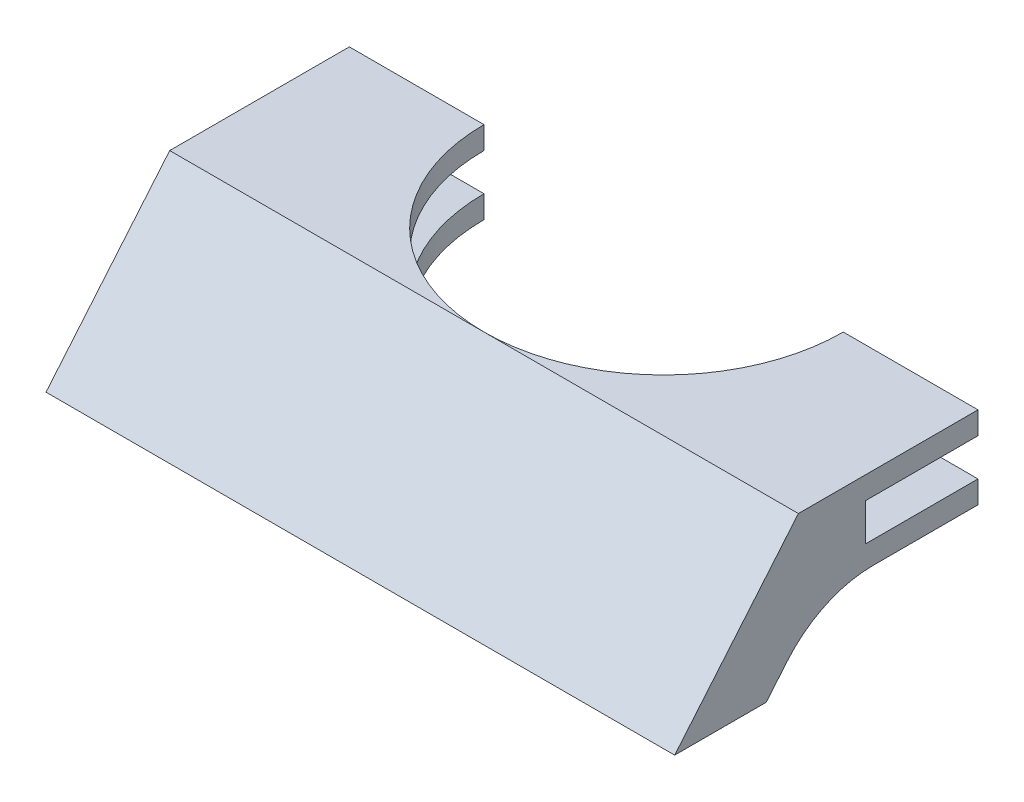
ISO-10303-21;
HEADER;
FILE_DESCRIPTION(('STEP AP214'),'2;1');
FILE_NAME('part.step','',(''),(''),'','','');
FILE_SCHEMA(('AUTOMOTIVE_DESIGN { 1 0 10303 214 1 1 1 1 }'));
ENDSEC;
DATA;
#1=APPLICATION_CONTEXT('core data for automotive mechanical design processes');
#2=APPLICATION_PROTOCOL_DEFINITION('international standard','automotive_design',2000,#1);
#3=PRODUCT_CONTEXT('',#1,'mechanical');
#4=PRODUCT('Part','Part','',(#3));
#5=PRODUCT_RELATED_PRODUCT_CATEGORY('part','',(#4));
#6=PRODUCT_DEFINITION_FORMATION('','',#4);
#7=PRODUCT_DEFINITION_CONTEXT('part definition',#1,'design');
#8=PRODUCT_DEFINITION('design','',#6,#7);
#9=PRODUCT_DEFINITION_SHAPE('','',#8);
#10=(LENGTH_UNIT() NAMED_UNIT(*) SI_UNIT(.MILLI.,.METRE.));
#11=(NAMED_UNIT(*) PLANE_ANGLE_UNIT() SI_UNIT($,.RADIAN.));
#12=(NAMED_UNIT(*) SI_UNIT($,.STERADIAN.) SOLID_ANGLE_UNIT());
#13=UNCERTAINTY_MEASURE_WITH_UNIT(LENGTH_MEASURE(1.E-05),#10,'distance_accuracy_value','');
#14=(GEOMETRIC_REPRESENTATION_CONTEXT(3) GLOBAL_UNCERTAINTY_ASSIGNED_CONTEXT((#13)) GLOBAL_UNIT_ASSIGNED_CONTEXT((#10,
#11,#12)) REPRESENTATION_CONTEXT('',''));
#15=CARTESIAN_POINT('',(0.,0.,0.));
#16=DIRECTION('',(0.,0.,1.));
#17=DIRECTION('',(1.,0.,0.));
#18=AXIS2_PLACEMENT_3D('',#15,#16,#17);
#19=CARTESIAN_POINT('',(56.,8.8,-34.2459224392896));
#20=DIRECTION('',(0.,-1.,0.));
#21=DIRECTION('',(0.,0.,-1.));
#22=AXIS2_PLACEMENT_3D('',#19,#20,#21);
#23=PLANE('',#22);
#24=DIRECTION('',(-1.,0.,0.));
#25=VECTOR('',#24,1.);
#26=CARTESIAN_POINT('',(56.,8.8,-44.2459224392897));
#27=LINE('',#26,#25);
#28=CARTESIAN_POINT('',(56.,8.8,-44.2459224392897));
#29=VERTEX_POINT('',#28);
#30=CARTESIAN_POINT('',(44.,8.8,-44.2459224392897));
#31=VERTEX_POINT('',#30);
#32=EDGE_CURVE('E314',#29,#31,#27,.T.);
#33=ORIENTED_EDGE('',*,*,#32,.T.);
#34=CARTESIAN_POINT('',(28.,8.8,-44.2459224392897));
#35=DIRECTION('',(0.,-1.,0.));
#36=DIRECTION('',(0.,0.,-1.));
#37=AXIS2_PLACEMENT_3D('',#34,#35,#36);
#38=CIRCLE('',#37,16.);
#39=CARTESIAN_POINT('',(40.4899959967968,8.8,-34.2459224392896));
#40=VERTEX_POINT('',#39);
#41=EDGE_CURVE('E260',#31,#40,#38,.T.);
#42=ORIENTED_EDGE('',*,*,#41,.T.);
#43=DIRECTION('',(-1.,0.,0.));
#44=VECTOR('',#43,1.);
#45=CARTESIAN_POINT('',(56.,8.8,-34.2459224392896));
#46=LINE('',#45,#44);
#47=CARTESIAN_POINT('',(56.,8.8,-34.2459224392896));
#48=VERTEX_POINT('',#47);
#49=EDGE_CURVE('E215',#48,#40,#46,.T.);
#50=ORIENTED_EDGE('',*,*,#49,.F.);
#51=DIRECTION('',(0.,0.,1.));
#52=VECTOR('',#51,1.);
#53=CARTESIAN_POINT('',(56.,8.8,-34.2459224392896));
#54=LINE('',#53,#52);
#55=EDGE_CURVE('E275',#29,#48,#54,.T.);
#56=ORIENTED_EDGE('',*,*,#55,.F.);
#57=EDGE_LOOP('',(#33,#42,#50,#56));
#58=FACE_BOUND('',#57,.T.);
#59=ADVANCED_FACE('F34',(#58),#23,.F.);
#60=CARTESIAN_POINT('',(56.,12.13,-34.2459224392897));
#61=DIRECTION('',(0.,0.,1.));
#62=DIRECTION('',(0.,-1.,0.));
#63=AXIS2_PLACEMENT_3D('',#60,#61,#62);
#64=PLANE('',#63);
#65=ORIENTED_EDGE('',*,*,#49,.T.);
#66=DIRECTION('',(0.,1.,0.));
#67=VECTOR('',#66,1.);
#68=CARTESIAN_POINT('',(40.4899959967968,1.00000000000002,-34.2459224392896));
#69=LINE('',#68,#67);
#70=CARTESIAN_POINT('',(40.4899959967968,12.13,-34.2459224392896));
#71=VERTEX_POINT('',#70);
#72=EDGE_CURVE('E264',#40,#71,#69,.T.);
#73=ORIENTED_EDGE('',*,*,#72,.T.);
#74=DIRECTION('',(-1.,0.,0.));
#75=VECTOR('',#74,1.);
#76=CARTESIAN_POINT('',(56.,12.13,-34.2459224392897));
#77=LINE('',#76,#75);
#78=CARTESIAN_POINT('',(56.,12.13,-34.2459224392897));
#79=VERTEX_POINT('',#78);
#80=EDGE_CURVE('E211',#79,#71,#77,.T.);
#81=ORIENTED_EDGE('',*,*,#80,.F.);
#82=DIRECTION('',(0.,1.,0.));
#83=VECTOR('',#82,1.);
#84=CARTESIAN_POINT('',(56.,12.13,-34.2459224392897));
#85=LINE('',#84,#83);
#86=EDGE_CURVE('E277',#48,#79,#85,.T.);
#87=ORIENTED_EDGE('',*,*,#86,.F.);
#88=EDGE_LOOP('',(#65,#73,#81,#87));
#89=FACE_BOUND('',#88,.T.);
#90=ADVANCED_FACE('F362',(#89),#64,.F.);
#91=CARTESIAN_POINT('',(56.,12.13,-44.2459224392897));
#92=DIRECTION('',(0.,1.,0.));
#93=DIRECTION('',(0.,0.,1.));
#94=AXIS2_PLACEMENT_3D('',#91,#92,#93);
#95=PLANE('',#94);
#96=ORIENTED_EDGE('',*,*,#80,.T.);
#97=CARTESIAN_POINT('',(28.,12.13,-44.2459224392897));
#98=DIRECTION('',(0.,1.,0.));
#99=DIRECTION('',(0.,0.,1.));
#100=AXIS2_PLACEMENT_3D('',#97,#98,#99);
#101=CIRCLE('',#100,16.);
#102=CARTESIAN_POINT('',(44.,12.13,-44.2459224392897));
#103=VERTEX_POINT('',#102);
#104=EDGE_CURVE('E270',#71,#103,#101,.T.);
#105=ORIENTED_EDGE('',*,*,#104,.T.);
#106=DIRECTION('',(-1.,0.,0.));
#107=VECTOR('',#106,1.);
#108=CARTESIAN_POINT('',(56.,12.13,-44.2459224392897));
#109=LINE('',#108,#107);
#110=CARTESIAN_POINT('',(56.,12.13,-44.2459224392897));
#111=VERTEX_POINT('',#110);
#112=EDGE_CURVE('E207',#111,#103,#109,.T.);
#113=ORIENTED_EDGE('',*,*,#112,.F.);
#114=DIRECTION('',(0.,0.,-1.));
#115=VECTOR('',#114,1.);
#116=CARTESIAN_POINT('',(56.,12.13,-44.2459224392897));
#117=LINE('',#116,#115);
#118=EDGE_CURVE('E280',#79,#111,#117,.T.);
#119=ORIENTED_EDGE('',*,*,#118,.F.);
#120=EDGE_LOOP('',(#96,#105,#113,#119));
#121=FACE_BOUND('',#120,.T.);
#122=ADVANCED_FACE('F358',(#121),#95,.F.);
#123=CARTESIAN_POINT('',(56.,14.13,-44.2459224392897));
#124=DIRECTION('',(0.,0.,1.));
#125=DIRECTION('',(1.,0.,0.));
#126=AXIS2_PLACEMENT_3D('',#123,#124,#125);
#127=PLANE('',#126);
#128=ORIENTED_EDGE('',*,*,#112,.T.);
#129=DIRECTION('',(0.,1.,0.));
#130=VECTOR('',#129,1.);
#131=CARTESIAN_POINT('',(44.,0.999999999999999,-44.2459224392897));
#132=LINE('',#131,#130);
#133=CARTESIAN_POINT('',(44.,14.13,-44.2459224392897));
#134=VERTEX_POINT('',#133);
#135=EDGE_CURVE('E272',#103,#134,#132,.T.);
#136=ORIENTED_EDGE('',*,*,#135,.T.);
#137=DIRECTION('',(-1.,0.,0.));
#138=VECTOR('',#137,1.);
#139=CARTESIAN_POINT('',(56.,14.13,-44.2459224392897));
#140=LINE('',#139,#138);
#141=CARTESIAN_POINT('',(56.,14.13,-44.2459224392897));
#142=VERTEX_POINT('',#141);
#143=EDGE_CURVE('E187',#142,#134,#140,.T.);
#144=ORIENTED_EDGE('',*,*,#143,.F.);
#145=DIRECTION('',(0.,1.,0.));
#146=VECTOR('',#145,1.);
#147=CARTESIAN_POINT('',(56.,14.13,-44.2459224392897));
#148=LINE('',#147,#146);
#149=EDGE_CURVE('E282',#111,#142,#148,.T.);
#150=ORIENTED_EDGE('',*,*,#149,.F.);
#151=EDGE_LOOP('',(#128,#136,#144,#150));
#152=FACE_BOUND('',#151,.T.);
#153=ADVANCED_FACE('F351',(#152),#127,.F.);
#154=CARTESIAN_POINT('',(56.,14.13,-28.2459224392897));
#155=DIRECTION('',(0.,-1.,0.));
#156=DIRECTION('',(0.,0.,-1.));
#157=AXIS2_PLACEMENT_3D('',#154,#155,#156);
#158=PLANE('',#157);
#159=ORIENTED_EDGE('',*,*,#143,.T.);
#160=CARTESIAN_POINT('',(28.,14.13,-44.2459224392897));
#161=DIRECTION('',(0.,1.,0.));
#162=DIRECTION('',(0.,0.,1.));
#163=AXIS2_PLACEMENT_3D('',#160,#161,#162);
#164=CIRCLE('',#163,16.);
#165=CARTESIAN_POINT('',(28.,14.13,-28.2459224392897));
#166=VERTEX_POINT('',#165);
#167=EDGE_CURVE('E170',#166,#134,#164,.T.);
#168=ORIENTED_EDGE('',*,*,#167,.F.);
#169=DIRECTION('',(-1.,0.,0.));
#170=VECTOR('',#169,1.);
#171=CARTESIAN_POINT('',(56.,14.13,-28.2459224392897));
#172=LINE('',#171,#170);
#173=CARTESIAN_POINT('',(56.,14.13,-28.2459224392897));
#174=VERTEX_POINT('',#173);
#175=EDGE_CURVE('E184',#174,#166,#172,.T.);
#176=ORIENTED_EDGE('',*,*,#175,.F.);
#177=DIRECTION('',(0.,0.,1.));
#178=VECTOR('',#177,1.);
#179=CARTESIAN_POINT('',(56.,14.13,-28.2459224392897));
#180=LINE('',#179,#178);
#181=EDGE_CURVE('E284',#142,#174,#180,.T.);
#182=ORIENTED_EDGE('',*,*,#181,.F.);
#183=EDGE_LOOP('',(#159,#168,#176,#182));
#184=FACE_BOUND('',#183,.T.);
#185=ADVANCED_FACE('F181',(#184),#158,.F.);
#186=CARTESIAN_POINT('',(56.,6.8,-44.2459224392897));
#187=DIRECTION('',(0.,1.,0.));
#188=DIRECTION('',(0.,0.,1.));
#189=AXIS2_PLACEMENT_3D('',#186,#187,#188);
#190=PLANE('',#189);
#191=DIRECTION('',(-1.,0.,0.));
#192=VECTOR('',#191,1.);
#193=CARTESIAN_POINT('',(0.,6.8,-34.9089990208396));
#194=LINE('',#193,#192);
#195=CARTESIAN_POINT('',(56.,6.8,-34.9089990208396));
#196=VERTEX_POINT('',#195);
#197=CARTESIAN_POINT('',(40.9931466965473,6.8,-34.9089990208396));
#198=VERTEX_POINT('',#197);
#199=EDGE_CURVE('E219',#196,#198,#194,.T.);
#200=ORIENTED_EDGE('',*,*,#199,.T.);
#201=CARTESIAN_POINT('',(28.,6.8,-44.2459224392897));
#202=DIRECTION('',(0.,1.,0.));
#203=DIRECTION('',(0.,0.,1.));
#204=AXIS2_PLACEMENT_3D('',#201,#202,#203);
#205=CIRCLE('',#204,16.);
#206=CARTESIAN_POINT('',(44.,6.8,-44.2459224392897));
#207=VERTEX_POINT('',#206);
#208=EDGE_CURVE('E55',#198,#207,#205,.T.);
#209=ORIENTED_EDGE('',*,*,#208,.T.);
#210=DIRECTION('',(-1.,0.,0.));
#211=VECTOR('',#210,1.);
#212=CARTESIAN_POINT('',(56.,6.8,-44.2459224392897));
#213=LINE('',#212,#211);
#214=CARTESIAN_POINT('',(56.,6.8,-44.2459224392897));
#215=VERTEX_POINT('',#214);
#216=EDGE_CURVE('E237',#215,#207,#213,.T.);
#217=ORIENTED_EDGE('',*,*,#216,.F.);
#218=DIRECTION('',(0.,0.,-1.));
#219=VECTOR('',#218,1.);
#220=CARTESIAN_POINT('',(56.,6.8,-44.2459224392897));
#221=LINE('',#220,#219);
#222=EDGE_CURVE('E229',#196,#215,#221,.T.);
#223=ORIENTED_EDGE('',*,*,#222,.F.);
#224=EDGE_LOOP('',(#200,#209,#217,#223));
#225=FACE_BOUND('',#224,.T.);
#226=ADVANCED_FACE('F235',(#225),#190,.F.);
#227=CARTESIAN_POINT('',(56.,8.8,-44.2459224392897));
#228=DIRECTION('',(0.,0.,1.));
#229=DIRECTION('',(1.,0.,0.));
#230=AXIS2_PLACEMENT_3D('',#227,#228,#229);
#231=PLANE('',#230);
#232=ORIENTED_EDGE('',*,*,#216,.T.);
#233=DIRECTION('',(0.,1.,0.));
#234=VECTOR('',#233,1.);
#235=CARTESIAN_POINT('',(44.,0.999999999999999,-44.2459224392897));
#236=LINE('',#235,#234);
#237=EDGE_CURVE('E254',#207,#31,#236,.T.);
#238=ORIENTED_EDGE('',*,*,#237,.T.);
#239=ORIENTED_EDGE('',*,*,#32,.F.);
#240=DIRECTION('',(0.,1.,0.));
#241=VECTOR('',#240,1.);
#242=CARTESIAN_POINT('',(56.,8.8,-44.2459224392897));
#243=LINE('',#242,#241);
#244=EDGE_CURVE('E239',#215,#29,#243,.T.);
#245=ORIENTED_EDGE('',*,*,#244,.F.);
#246=EDGE_LOOP('',(#232,#238,#239,#245));
#247=FACE_BOUND('',#246,.T.);
#248=ADVANCED_FACE('F370',(#247),#231,.F.);
#249=CARTESIAN_POINT('',(15.5100040032032,8.8,-34.2459224392896));
#250=VERTEX_POINT('',#249);
#251=CARTESIAN_POINT('',(0.,8.8,-34.2459224392896));
#252=VERTEX_POINT('',#251);
#253=EDGE_CURVE('E214',#250,#252,#46,.T.);
#254=ORIENTED_EDGE('',*,*,#253,.F.);
#255=CARTESIAN_POINT('',(12.,8.8,-44.2459224392897));
#256=VERTEX_POINT('',#255);
#257=EDGE_CURVE('E257',#250,#256,#38,.T.);
#258=ORIENTED_EDGE('',*,*,#257,.T.);
#259=CARTESIAN_POINT('',(0.,8.8,-44.2459224392897));
#260=VERTEX_POINT('',#259);
#261=EDGE_CURVE('E291',#256,#260,#27,.T.);
#262=ORIENTED_EDGE('',*,*,#261,.T.);
#263=DIRECTION('',(0.,0.,1.));
#264=VECTOR('',#263,1.);
#265=CARTESIAN_POINT('',(0.,8.8,-34.2459224392896));
#266=LINE('',#265,#264);
#267=EDGE_CURVE('E274',#260,#252,#266,.T.);
#268=ORIENTED_EDGE('',*,*,#267,.T.);
#269=EDGE_LOOP('',(#254,#258,#262,#268));
#270=FACE_BOUND('',#269,.T.);
#271=ADVANCED_FACE('F338',(#270),#23,.F.);
#272=CARTESIAN_POINT('',(15.5100040032032,12.13,-34.2459224392896));
#273=VERTEX_POINT('',#272);
#274=CARTESIAN_POINT('',(0.,12.13,-34.2459224392897));
#275=VERTEX_POINT('',#274);
#276=EDGE_CURVE('E210',#273,#275,#77,.T.);
#277=ORIENTED_EDGE('',*,*,#276,.F.);
#278=DIRECTION('',(0.,1.,0.));
#279=VECTOR('',#278,1.);
#280=CARTESIAN_POINT('',(15.5100040032032,1.00000000000002,-34.2459224392896));
#281=LINE('',#280,#279);
#282=EDGE_CURVE('E261',#273,#250,#281,.F.);
#283=ORIENTED_EDGE('',*,*,#282,.T.);
#284=ORIENTED_EDGE('',*,*,#253,.T.);
#285=DIRECTION('',(0.,1.,0.));
#286=VECTOR('',#285,1.);
#287=CARTESIAN_POINT('',(0.,12.13,-34.2459224392897));
#288=LINE('',#287,#286);
#289=EDGE_CURVE('E294',#252,#275,#288,.T.);
#290=ORIENTED_EDGE('',*,*,#289,.T.);
#291=EDGE_LOOP('',(#277,#283,#284,#290));
#292=FACE_BOUND('',#291,.T.);
#293=ADVANCED_FACE('F341',(#292),#64,.F.);
#294=CARTESIAN_POINT('',(12.,12.13,-44.2459224392897));
#295=VERTEX_POINT('',#294);
#296=CARTESIAN_POINT('',(0.,12.13,-44.2459224392897));
#297=VERTEX_POINT('',#296);
#298=EDGE_CURVE('E206',#295,#297,#109,.T.);
#299=ORIENTED_EDGE('',*,*,#298,.F.);
#300=EDGE_CURVE('E267',#295,#273,#101,.T.);
#301=ORIENTED_EDGE('',*,*,#300,.T.);
#302=ORIENTED_EDGE('',*,*,#276,.T.);
#303=DIRECTION('',(0.,0.,-1.));
#304=VECTOR('',#303,1.);
#305=CARTESIAN_POINT('',(0.,12.13,-44.2459224392897));
#306=LINE('',#305,#304);
#307=EDGE_CURVE('E297',#275,#297,#306,.T.);
#308=ORIENTED_EDGE('',*,*,#307,.T.);
#309=EDGE_LOOP('',(#299,#301,#302,#308));
#310=FACE_BOUND('',#309,.T.);
#311=ADVANCED_FACE('F346',(#310),#95,.F.);
#312=CARTESIAN_POINT('',(12.,14.13,-44.2459224392897));
#313=VERTEX_POINT('',#312);
#314=CARTESIAN_POINT('',(0.,14.13,-44.2459224392897));
#315=VERTEX_POINT('',#314);
#316=EDGE_CURVE('E201',#313,#315,#140,.T.);
#317=ORIENTED_EDGE('',*,*,#316,.F.);
#318=DIRECTION('',(0.,1.,0.));
#319=VECTOR('',#318,1.);
#320=CARTESIAN_POINT('',(12.,0.999999999999999,-44.2459224392897));
#321=LINE('',#320,#319);
#322=EDGE_CURVE('E173',#313,#295,#321,.F.);
#323=ORIENTED_EDGE('',*,*,#322,.T.);
#324=ORIENTED_EDGE('',*,*,#298,.T.);
#325=DIRECTION('',(0.,1.,0.));
#326=VECTOR('',#325,1.);
#327=CARTESIAN_POINT('',(0.,14.13,-44.2459224392897));
#328=LINE('',#327,#326);
#329=EDGE_CURVE('E300',#297,#315,#328,.T.);
#330=ORIENTED_EDGE('',*,*,#329,.T.);
#331=EDGE_LOOP('',(#317,#323,#324,#330));
#332=FACE_BOUND('',#331,.T.);
#333=ADVANCED_FACE('F348',(#332),#127,.F.);
#334=CARTESIAN_POINT('',(0.,14.13,-28.2459224392897));
#335=VERTEX_POINT('',#334);
#336=EDGE_CURVE('E190',#166,#335,#172,.T.);
#337=ORIENTED_EDGE('',*,*,#336,.F.);
#338=EDGE_CURVE('E167',#313,#166,#164,.T.);
#339=ORIENTED_EDGE('',*,*,#338,.F.);
#340=ORIENTED_EDGE('',*,*,#316,.T.);
#341=DIRECTION('',(0.,0.,1.));
#342=VECTOR('',#341,1.);
#343=CARTESIAN_POINT('',(0.,14.13,-28.2459224392897));
#344=LINE('',#343,#342);
#345=EDGE_CURVE('E193',#315,#335,#344,.T.);
#346=ORIENTED_EDGE('',*,*,#345,.T.);
#347=EDGE_LOOP('',(#337,#339,#340,#346));
#348=FACE_BOUND('',#347,.T.);
#349=ADVANCED_FACE('F191',(#348),#158,.F.);
#350=CARTESIAN_POINT('',(56.,0.999999999999999,-17.2285442819318));
#351=DIRECTION('',(0.,-0.642787609686543,-0.766044443118975));
#352=DIRECTION('',(0.,0.766044443118975,-0.642787609686543));
#353=AXIS2_PLACEMENT_3D('',#350,#351,#352);
#354=PLANE('',#353);
#355=DIRECTION('',(0.,-0.766044443118975,0.642787609686543));
#356=VECTOR('',#355,1.);
#357=CARTESIAN_POINT('',(0.,0.999999999999999,-17.2285442819318));
#358=LINE('',#357,#356);
#359=CARTESIAN_POINT('',(0.,0.999999999999999,-17.2285442819318));
#360=VERTEX_POINT('',#359);
#361=EDGE_CURVE('E304',#335,#360,#358,.T.);
#362=ORIENTED_EDGE('',*,*,#361,.T.);
#363=DIRECTION('',(-1.,0.,0.));
#364=VECTOR('',#363,1.);
#365=CARTESIAN_POINT('',(56.,0.999999999999999,-17.2285442819318));
#366=LINE('',#365,#364);
#367=CARTESIAN_POINT('',(56.,0.999999999999999,-17.2285442819318));
#368=VERTEX_POINT('',#367);
#369=EDGE_CURVE('E196',#368,#360,#366,.T.);
#370=ORIENTED_EDGE('',*,*,#369,.F.);
#371=DIRECTION('',(0.,-0.766044443118975,0.642787609686543));
#372=VECTOR('',#371,1.);
#373=CARTESIAN_POINT('',(56.,0.999999999999999,-17.2285442819318));
#374=LINE('',#373,#372);
#375=EDGE_CURVE('E200',#174,#368,#374,.T.);
#376=ORIENTED_EDGE('',*,*,#375,.F.);
#377=ORIENTED_EDGE('',*,*,#175,.T.);
#378=ORIENTED_EDGE('',*,*,#336,.T.);
#379=EDGE_LOOP('',(#362,#370,#376,#377,#378));
#380=FACE_BOUND('',#379,.T.);
#381=ADVANCED_FACE('F198',(#380),#354,.F.);
#382=CARTESIAN_POINT('',(56.,1.,-25.3791445784614));
#383=DIRECTION('',(0.,1.,0.));
#384=DIRECTION('',(0.,0.,1.));
#385=AXIS2_PLACEMENT_3D('',#382,#383,#384);
#386=PLANE('',#385);
#387=DIRECTION('',(0.,0.,-1.));
#388=VECTOR('',#387,1.);
#389=CARTESIAN_POINT('',(0.,1.,-25.3791445784614));
#390=LINE('',#389,#388);
#391=CARTESIAN_POINT('',(0.,1.,-25.3791445784614));
#392=VERTEX_POINT('',#391);
#393=EDGE_CURVE('E306',#360,#392,#390,.T.);
#394=ORIENTED_EDGE('',*,*,#393,.T.);
#395=DIRECTION('',(-1.,0.,0.));
#396=VECTOR('',#395,1.);
#397=CARTESIAN_POINT('',(56.,1.,-25.3791445784614));
#398=LINE('',#397,#396);
#399=CARTESIAN_POINT('',(56.,1.,-25.3791445784614));
#400=VERTEX_POINT('',#399);
#401=EDGE_CURVE('E317',#400,#392,#398,.T.);
#402=ORIENTED_EDGE('',*,*,#401,.F.);
#403=DIRECTION('',(0.,0.,-1.));
#404=VECTOR('',#403,1.);
#405=CARTESIAN_POINT('',(56.,1.,-25.3791445784614));
#406=LINE('',#405,#404);
#407=EDGE_CURVE('E287',#368,#400,#406,.T.);
#408=ORIENTED_EDGE('',*,*,#407,.F.);
#409=ORIENTED_EDGE('',*,*,#369,.T.);
#410=EDGE_LOOP('',(#394,#402,#408,#409));
#411=FACE_BOUND('',#410,.T.);
#412=ADVANCED_FACE('F325',(#411),#386,.F.);
#413=CARTESIAN_POINT('',(56.,6.8,-30.2459224392897));
#414=DIRECTION('',(0.,0.642787609686544,0.766044443118974));
#415=DIRECTION('',(0.,-0.766044443118974,0.642787609686544));
#416=AXIS2_PLACEMENT_3D('',#413,#414,#415);
#417=PLANE('',#416);
#418=DIRECTION('',(0.,0.766044443118974,-0.642787609686544));
#419=VECTOR('',#418,1.);
#420=CARTESIAN_POINT('',(0.,6.8,-30.2459224392897));
#421=LINE('',#420,#419);
#422=CARTESIAN_POINT('',(0.,3.22787609686544,-27.2485545896499));
#423=VERTEX_POINT('',#422);
#424=EDGE_CURVE('E308',#392,#423,#421,.T.);
#425=ORIENTED_EDGE('',*,*,#424,.T.);
#426=DIRECTION('',(-1.,0.,0.));
#427=VECTOR('',#426,1.);
#428=CARTESIAN_POINT('',(56.,3.22787609686544,-27.2485545896499));
#429=LINE('',#428,#427);
#430=CARTESIAN_POINT('',(56.,3.22787609686544,-27.2485545896499));
#431=VERTEX_POINT('',#430);
#432=EDGE_CURVE('E62',#423,#431,#429,.F.);
#433=ORIENTED_EDGE('',*,*,#432,.T.);
#434=DIRECTION('',(0.,0.766044443118974,-0.642787609686544));
#435=VECTOR('',#434,1.);
#436=CARTESIAN_POINT('',(56.,6.8,-30.2459224392897));
#437=LINE('',#436,#435);
#438=EDGE_CURVE('E231',#400,#431,#437,.T.);
#439=ORIENTED_EDGE('',*,*,#438,.F.);
#440=ORIENTED_EDGE('',*,*,#401,.T.);
#441=EDGE_LOOP('',(#425,#433,#439,#440));
#442=FACE_BOUND('',#441,.T.);
#443=ADVANCED_FACE('F330',(#442),#417,.F.);
#444=CARTESIAN_POINT('',(12.,6.8,-44.2459224392897));
#445=VERTEX_POINT('',#444);
#446=CARTESIAN_POINT('',(0.,6.8,-44.2459224392897));
#447=VERTEX_POINT('',#446);
#448=EDGE_CURVE('E249',#445,#447,#213,.T.);
#449=ORIENTED_EDGE('',*,*,#448,.F.);
#450=CARTESIAN_POINT('',(15.0068533034527,6.8,-34.9089990208396));
#451=VERTEX_POINT('',#450);
#452=EDGE_CURVE('E188',#445,#451,#205,.T.);
#453=ORIENTED_EDGE('',*,*,#452,.T.);
#454=CARTESIAN_POINT('',(0.,6.8,-34.9089990208396));
#455=VERTEX_POINT('',#454);
#456=EDGE_CURVE('E218',#451,#455,#194,.T.);
#457=ORIENTED_EDGE('',*,*,#456,.T.);
#458=DIRECTION('',(0.,0.,-1.));
#459=VECTOR('',#458,1.);
#460=CARTESIAN_POINT('',(0.,6.8,-44.2459224392897));
#461=LINE('',#460,#459);
#462=EDGE_CURVE('E310',#455,#447,#461,.T.);
#463=ORIENTED_EDGE('',*,*,#462,.T.);
#464=EDGE_LOOP('',(#449,#453,#457,#463));
#465=FACE_BOUND('',#464,.T.);
#466=ADVANCED_FACE('F247',(#465),#190,.F.);
#467=ORIENTED_EDGE('',*,*,#261,.F.);
#468=DIRECTION('',(0.,1.,0.));
#469=VECTOR('',#468,1.);
#470=CARTESIAN_POINT('',(12.,0.999999999999999,-44.2459224392897));
#471=LINE('',#470,#469);
#472=EDGE_CURVE('E251',#256,#445,#471,.F.);
#473=ORIENTED_EDGE('',*,*,#472,.T.);
#474=ORIENTED_EDGE('',*,*,#448,.T.);
#475=DIRECTION('',(0.,1.,0.));
#476=VECTOR('',#475,1.);
#477=CARTESIAN_POINT('',(0.,8.8,-44.2459224392897));
#478=LINE('',#477,#476);
#479=EDGE_CURVE('E278',#447,#260,#478,.T.);
#480=ORIENTED_EDGE('',*,*,#479,.T.);
#481=EDGE_LOOP('',(#467,#473,#474,#480));
#482=FACE_BOUND('',#481,.T.);
#483=ADVANCED_FACE('F335',(#482),#231,.F.);
#484=CARTESIAN_POINT('',(56.,0.,0.));
#485=DIRECTION('',(-1.,0.,0.));
#486=DIRECTION('',(0.,0.,1.));
#487=AXIS2_PLACEMENT_3D('',#484,#485,#486);
#488=PLANE('',#487);
#489=ORIENTED_EDGE('',*,*,#55,.T.);
#490=ORIENTED_EDGE('',*,*,#86,.T.);
#491=ORIENTED_EDGE('',*,*,#118,.T.);
#492=ORIENTED_EDGE('',*,*,#149,.T.);
#493=ORIENTED_EDGE('',*,*,#181,.T.);
#494=ORIENTED_EDGE('',*,*,#375,.T.);
#495=ORIENTED_EDGE('',*,*,#407,.T.);
#496=ORIENTED_EDGE('',*,*,#438,.T.);
#497=CARTESIAN_POINT('',(56.,-3.2,-34.9089990208396));
#498=DIRECTION('',(-1.,0.,0.));
#499=DIRECTION('',(0.,0.,1.));
#500=AXIS2_PLACEMENT_3D('',#497,#498,#499);
#501=CIRCLE('',#500,10.);
#502=EDGE_CURVE('E48',#431,#196,#501,.T.);
#503=ORIENTED_EDGE('',*,*,#502,.T.);
#504=ORIENTED_EDGE('',*,*,#222,.T.);
#505=ORIENTED_EDGE('',*,*,#244,.T.);
#506=EDGE_LOOP('',(#489,#490,#491,#492,#493,#494,#495,#496,#503,#504,#505));
#507=FACE_BOUND('',#506,.T.);
#508=ADVANCED_FACE('F228',(#507),#488,.F.);
#509=CARTESIAN_POINT('',(0.,0.,0.));
#510=DIRECTION('',(-1.,0.,0.));
#511=DIRECTION('',(0.,0.,1.));
#512=AXIS2_PLACEMENT_3D('',#509,#510,#511);
#513=PLANE('',#512);
#514=ORIENTED_EDGE('',*,*,#267,.F.);
#515=ORIENTED_EDGE('',*,*,#479,.F.);
#516=ORIENTED_EDGE('',*,*,#462,.F.);
#517=CARTESIAN_POINT('',(0.,-3.2,-34.9089990208396));
#518=DIRECTION('',(-1.,0.,0.));
#519=DIRECTION('',(0.,0.,1.));
#520=AXIS2_PLACEMENT_3D('',#517,#518,#519);
#521=CIRCLE('',#520,10.);
#522=EDGE_CURVE('E223',#455,#423,#521,.F.);
#523=ORIENTED_EDGE('',*,*,#522,.T.);
#524=ORIENTED_EDGE('',*,*,#424,.F.);
#525=ORIENTED_EDGE('',*,*,#393,.F.);
#526=ORIENTED_EDGE('',*,*,#361,.F.);
#527=ORIENTED_EDGE('',*,*,#345,.F.);
#528=ORIENTED_EDGE('',*,*,#329,.F.);
#529=ORIENTED_EDGE('',*,*,#307,.F.);
#530=ORIENTED_EDGE('',*,*,#289,.F.);
#531=EDGE_LOOP('',(#514,#515,#516,#523,#524,#525,#526,#527,#528,#529,#530));
#532=FACE_BOUND('',#531,.T.);
#533=ADVANCED_FACE('F328',(#532),#513,.T.);
#534=CARTESIAN_POINT('',(56.,-3.2,-34.9089990208396));
#535=DIRECTION('',(1.,0.,0.));
#536=DIRECTION('',(0.,0.,-1.));
#537=AXIS2_PLACEMENT_3D('',#534,#535,#536);
#538=CYLINDRICAL_SURFACE('',#537,10.);
#539=ORIENTED_EDGE('',*,*,#456,.F.);
#540=CARTESIAN_POINT('',(15.0068533034527,6.8,-34.9089990208396));
#541=CARTESIAN_POINT('',(15.1325220384248,6.80000155733554,-34.7341027068865));
#542=CARTESIAN_POINT('',(15.261715421339,6.79541225292043,-34.5617866936351));
#543=CARTESIAN_POINT('',(15.5266789522303,6.77787285021238,-34.2228274862549));
#544=CARTESIAN_POINT('',(15.662446529082,6.76492599646222,-34.0561821171036));
#545=CARTESIAN_POINT('',(15.9398443923659,6.73153204959592,-33.7293402516273));
#546=CARTESIAN_POINT('',(16.0814595253452,6.71110338066,-33.5691289775394));
#547=CARTESIAN_POINT('',(16.3704673216887,6.66355154961324,-33.2550383423842));
#548=CARTESIAN_POINT('',(16.5178605580009,6.63642772220085,-33.1011596123594));
#549=CARTESIAN_POINT('',(16.9660063860148,6.54663742122897,-32.651565802915));
#550=CARTESIAN_POINT('',(17.2747796198239,6.47528206061327,-32.3654786099039));
#551=CARTESIAN_POINT('',(17.9113145603976,6.31531258931458,-31.8203726697334));
#552=CARTESIAN_POINT('',(18.2390892700112,6.22668655986658,-31.5613728067474));
#553=CARTESIAN_POINT('',(18.9479774151478,6.02775725940969,-31.0446543552113));
#554=CARTESIAN_POINT('',(19.3310275896715,5.91614648195695,-30.7900973434239));
#555=CARTESIAN_POINT('',(20.1161021985065,5.68650242703765,-30.3155742399277));
#556=CARTESIAN_POINT('',(20.5181274380316,5.56846887698585,-30.0956096178784));
#557=CARTESIAN_POINT('',(21.3406877016393,5.33351192419847,-29.6903666681307));
#558=CARTESIAN_POINT('',(21.7612584561195,5.21659124380435,-29.5051592643813));
#559=CARTESIAN_POINT('',(22.6189741254376,4.99235890871296,-29.1709011165631));
#560=CARTESIAN_POINT('',(23.0561140681666,4.88504440336934,-29.0218396235535));
#561=CARTESIAN_POINT('',(23.8406273754507,4.71184989033132,-28.7919574996683));
#562=CARTESIAN_POINT('',(24.1848813970618,4.64216496363292,-28.7033333981908));
#563=CARTESIAN_POINT('',(24.8810649759861,4.5173760478009,-28.5488107725192));
#564=CARTESIAN_POINT('',(25.2329932615136,4.46226966227922,-28.4829085128188));
#565=CARTESIAN_POINT('',(25.9416275503016,4.37032924280899,-28.3748453020006));
#566=CARTESIAN_POINT('',(26.2983129863929,4.33343308551872,-28.3326035666368));
#567=CARTESIAN_POINT('',(27.0152734755797,4.28028009524076,-28.2722034704451));
#568=CARTESIAN_POINT('',(27.3755484015636,4.26402253399486,-28.2540442598348));
#569=CARTESIAN_POINT('',(28.0981803733955,4.25338235823784,-28.2421284060159));
#570=CARTESIAN_POINT('',(28.4605401714022,4.25908162437488,-28.2484631049763));
#571=CARTESIAN_POINT('',(29.1829926737383,4.29208872982826,-28.2856158975563));
#572=CARTESIAN_POINT('',(29.5430853212154,4.31939710886727,-28.3164346027039));
#573=CARTESIAN_POINT('',(30.2592923763373,4.39366353600466,-28.4021207870273));
#574=CARTESIAN_POINT('',(30.6153934803759,4.44067423248364,-28.4570527201645));
#575=CARTESIAN_POINT('',(31.3206084448756,4.55112399378802,-28.5901760665785));
#576=CARTESIAN_POINT('',(31.6697212284031,4.61456557001134,-28.6683710357942));
#577=CARTESIAN_POINT('',(32.4523240376147,4.77282888814209,-28.8712273228365));
#578=CARTESIAN_POINT('',(32.8832644356804,4.87150159771931,-29.0027291807675));
#579=CARTESIAN_POINT('',(33.729969141773,5.08109823767379,-29.3003881141203));
#580=CARTESIAN_POINT('',(34.1457280413066,5.19202647857499,-29.4665574011661));
#581=CARTESIAN_POINT('',(34.961364168571,5.41847577851769,-29.8327518889996));
#582=CARTESIAN_POINT('',(35.3612217946808,5.53400217508423,-30.0328173684182));
#583=CARTESIAN_POINT('',(36.1433492329425,5.76213605731137,-30.4660234325404));
#584=CARTESIAN_POINT('',(36.5256244611371,5.87474443710118,-30.6991537404335));
#585=CARTESIAN_POINT('',(37.2075875300732,6.07157824228494,-31.1555168368486));
#586=CARTESIAN_POINT('',(37.5102393517821,6.15736849898368,-31.3736536867065));
#587=CARTESIAN_POINT('',(38.1014178602971,6.31798955046332,-31.8321693341698));
#588=CARTESIAN_POINT('',(38.3899427788709,6.39281897562466,-32.072550905269));
#589=CARTESIAN_POINT('',(38.9501640328607,6.52700880232464,-32.5739622800953));
#590=CARTESIAN_POINT('',(39.2219238222738,6.58643065757416,-32.8349044676487));
#591=CARTESIAN_POINT('',(39.7478911258347,6.68581901680169,-33.377182748124));
#592=CARTESIAN_POINT('',(40.0021117290476,6.7258001666684,-33.6585033045964));
#593=CARTESIAN_POINT('',(40.3766896412784,6.76876077778189,-34.1040034682476));
#594=CARTESIAN_POINT('',(40.5040929129907,6.78030049244763,-34.2614991663871));
#595=CARTESIAN_POINT('',(40.7530876258129,6.79592266541687,-34.5815586936966));
#596=CARTESIAN_POINT('',(40.8746747462762,6.79999966116684,-34.7441261468331));
#597=CARTESIAN_POINT('',(40.9931466965473,6.8,-34.9089990208396));
#598=B_SPLINE_CURVE_WITH_KNOTS('',3,(#540,#541,#542,#543,#544,#545,#546,#547,#548,#549,#550,
#551,#552,#553,#554,#555,#556,#557,#558,#559,#560,#561,#562,#563,#564,#565,#566,#567,#568,#569,
#570,#571,#572,#573,#574,#575,#576,#577,#578,#579,#580,#581,#582,#583,#584,#585,#586,#587,#588,
#589,#590,#591,#592,#593,#594,#595,#596,#597),.UNSPECIFIED.,.F.,.F.,(4,2,2,2,2,2,2,2,2,2,2,2,2,
2,2,2,2,2,2,2,2,2,2,2,2,2,2,2,4),(0.,0.645939780098185,1.29162894607592,1.93573865947956,
2.57991240420248,3.8587557919145,5.13848487551744,6.55647444288627,7.97452423735332,
9.39543690157969,10.8159265002956,11.9017015182818,12.9872979479431,14.0691648668967,
15.1509936097865,16.2368605694383,17.3227546512362,18.4115691409565,19.5005501501749,
20.8823085993925,22.264554598193,23.6484547815313,25.0319257764997,26.1793895902254,
27.3269966641269,28.469953492913,29.6120479222161,30.220503487187,30.8294042510236),.UNSPECIFIED.);
#599=EDGE_CURVE('E11',#451,#198,#598,.T.);
#600=ORIENTED_EDGE('',*,*,#599,.T.);
#601=ORIENTED_EDGE('',*,*,#199,.F.);
#602=ORIENTED_EDGE('',*,*,#502,.F.);
#603=ORIENTED_EDGE('',*,*,#432,.F.);
#604=ORIENTED_EDGE('',*,*,#522,.F.);
#605=EDGE_LOOP('',(#539,#600,#601,#602,#603,#604));
#606=FACE_BOUND('',#605,.T.);
#607=ADVANCED_FACE('F36',(#606),#538,.F.);
#608=CARTESIAN_POINT('',(28.,0.999999999999999,-44.2459224392897));
#609=DIRECTION('',(0.,1.,0.));
#610=DIRECTION('',(0.,0.,1.));
#611=AXIS2_PLACEMENT_3D('',#608,#609,#610);
#612=CYLINDRICAL_SURFACE('',#611,16.);
#613=ORIENTED_EDGE('',*,*,#104,.F.);
#614=ORIENTED_EDGE('',*,*,#72,.F.);
#615=ORIENTED_EDGE('',*,*,#41,.F.);
#616=ORIENTED_EDGE('',*,*,#237,.F.);
#617=ORIENTED_EDGE('',*,*,#208,.F.);
#618=ORIENTED_EDGE('',*,*,#599,.F.);
#619=ORIENTED_EDGE('',*,*,#452,.F.);
#620=ORIENTED_EDGE('',*,*,#472,.F.);
#621=ORIENTED_EDGE('',*,*,#257,.F.);
#622=ORIENTED_EDGE('',*,*,#282,.F.);
#623=ORIENTED_EDGE('',*,*,#300,.F.);
#624=ORIENTED_EDGE('',*,*,#322,.F.);
#625=ORIENTED_EDGE('',*,*,#338,.T.);
#626=ORIENTED_EDGE('',*,*,#167,.T.);
#627=ORIENTED_EDGE('',*,*,#135,.F.);
#628=EDGE_LOOP('',(#613,#614,#615,#616,#617,#618,#619,#620,#621,#622,#623,#624,#625,#626,#627));
#629=FACE_BOUND('',#628,.T.);
#630=ADVANCED_FACE('F169',(#629),#612,.F.);
#631=CLOSED_SHELL('',(#59,#90,#122,#153,#185,#226,#248,#271,#293,#311,#333,#349,#381,#412,#443,
#466,#483,#508,#533,#607,#630));
#632=MANIFOLD_SOLID_BREP('B2',#631);
#633=ADVANCED_BREP_SHAPE_REPRESENTATION('',(#18,#632),#14);
#634=SHAPE_DEFINITION_REPRESENTATION(#9,#633);
ENDSEC;
END-ISO-10303-21;
